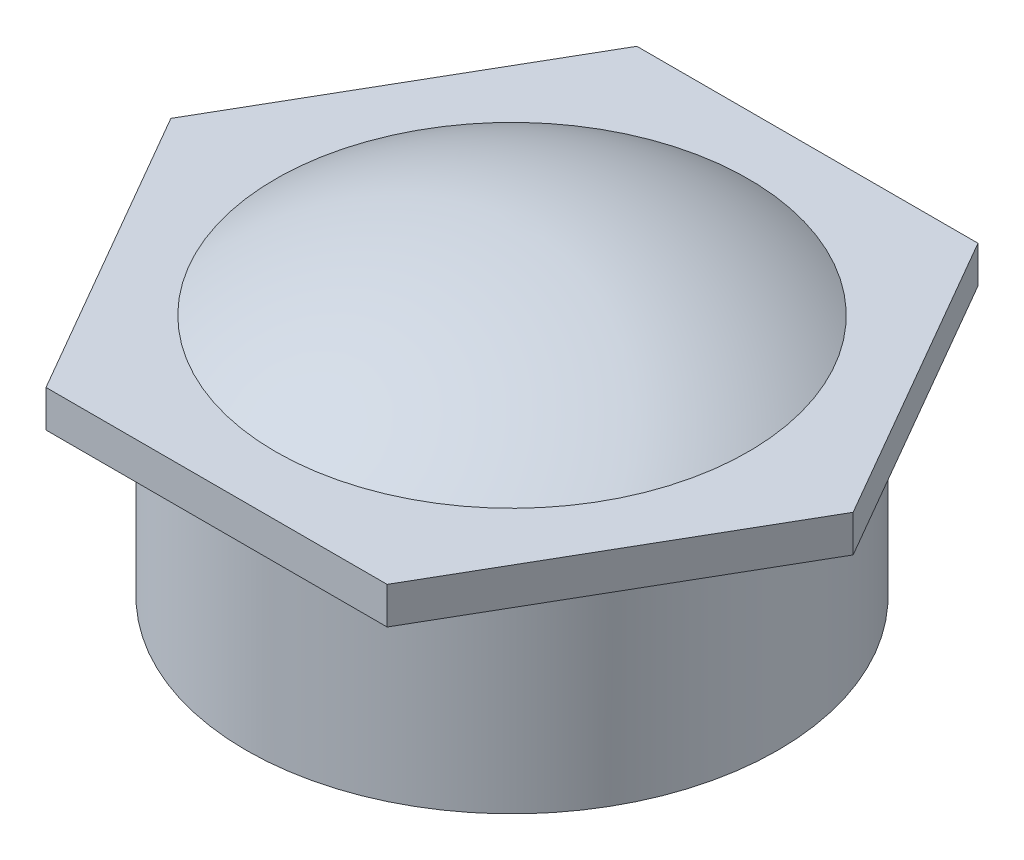
ISO-10303-21;
HEADER;
FILE_DESCRIPTION(('STEP AP214'),'2;1');
FILE_NAME('part.step','',(''),(''),'','','');
FILE_SCHEMA(('AUTOMOTIVE_DESIGN { 1 0 10303 214 1 1 1 1 }'));
ENDSEC;
DATA;
#1=APPLICATION_CONTEXT('core data for automotive mechanical design processes');
#2=APPLICATION_PROTOCOL_DEFINITION('international standard','automotive_design',2000,#1);
#3=PRODUCT_CONTEXT('',#1,'mechanical');
#4=PRODUCT('Part','Part','',(#3));
#5=PRODUCT_RELATED_PRODUCT_CATEGORY('part','',(#4));
#6=PRODUCT_DEFINITION_FORMATION('','',#4);
#7=PRODUCT_DEFINITION_CONTEXT('part definition',#1,'design');
#8=PRODUCT_DEFINITION('design','',#6,#7);
#9=PRODUCT_DEFINITION_SHAPE('','',#8);
#10=(LENGTH_UNIT() NAMED_UNIT(*) SI_UNIT(.MILLI.,.METRE.));
#11=(NAMED_UNIT(*) PLANE_ANGLE_UNIT() SI_UNIT($,.RADIAN.));
#12=(NAMED_UNIT(*) SI_UNIT($,.STERADIAN.) SOLID_ANGLE_UNIT());
#13=UNCERTAINTY_MEASURE_WITH_UNIT(LENGTH_MEASURE(1.E-05),#10,'distance_accuracy_value','');
#14=(GEOMETRIC_REPRESENTATION_CONTEXT(3) GLOBAL_UNCERTAINTY_ASSIGNED_CONTEXT((#13)) GLOBAL_UNIT_ASSIGNED_CONTEXT((#10,
#11,#12)) REPRESENTATION_CONTEXT('',''));
#15=CARTESIAN_POINT('',(0.,0.,0.));
#16=DIRECTION('',(0.,0.,1.));
#17=DIRECTION('',(1.,0.,0.));
#18=AXIS2_PLACEMENT_3D('',#15,#16,#17);
#19=CARTESIAN_POINT('',(0.,2.5,0.));
#20=DIRECTION('',(0.,1.,0.));
#21=DIRECTION('',(0.,0.,1.));
#22=AXIS2_PLACEMENT_3D('',#19,#20,#21);
#23=PLANE('',#22);
#24=DIRECTION('',(0.499999999999995,0.,-0.866025403784441));
#25=VECTOR('',#24,1.);
#26=CARTESIAN_POINT('',(11.5470053837928,2.5,19.9999999999999));
#27=LINE('',#26,#25);
#28=CARTESIAN_POINT('',(11.5470053837928,2.5,19.9999999999999));
#29=VERTEX_POINT('',#28);
#30=CARTESIAN_POINT('',(23.0940107675851,2.5,0.));
#31=VERTEX_POINT('',#30);
#32=EDGE_CURVE('E147',#29,#31,#27,.T.);
#33=ORIENTED_EDGE('',*,*,#32,.T.);
#34=DIRECTION('',(-0.500000000000001,0.,-0.866025403784438));
#35=VECTOR('',#34,1.);
#36=CARTESIAN_POINT('',(23.0940107675851,2.5,0.));
#37=LINE('',#36,#35);
#38=CARTESIAN_POINT('',(11.5470053837925,2.5,-20.));
#39=VERTEX_POINT('',#38);
#40=EDGE_CURVE('E105',#31,#39,#37,.T.);
#41=ORIENTED_EDGE('',*,*,#40,.T.);
#42=DIRECTION('',(-1.,0.,0.));
#43=VECTOR('',#42,1.);
#44=CARTESIAN_POINT('',(11.5470053837925,2.5,-20.));
#45=LINE('',#44,#43);
#46=CARTESIAN_POINT('',(-11.5470053837926,2.5,-20.));
#47=VERTEX_POINT('',#46);
#48=EDGE_CURVE('E118',#39,#47,#45,.T.);
#49=ORIENTED_EDGE('',*,*,#48,.T.);
#50=DIRECTION('',(-0.499999999999995,0.,0.866025403784442));
#51=VECTOR('',#50,1.);
#52=CARTESIAN_POINT('',(-11.5470053837926,2.5,-20.));
#53=LINE('',#52,#51);
#54=CARTESIAN_POINT('',(-23.0940107675851,2.5,1.61264615268131E-13));
#55=VERTEX_POINT('',#54);
#56=EDGE_CURVE('E112',#47,#55,#53,.T.);
#57=ORIENTED_EDGE('',*,*,#56,.T.);
#58=DIRECTION('',(0.500000000000007,0.,0.866025403784434));
#59=VECTOR('',#58,1.);
#60=CARTESIAN_POINT('',(-23.0940107675851,2.5,1.61264615268131E-13));
#61=LINE('',#60,#59);
#62=CARTESIAN_POINT('',(-11.5470053837923,2.5,20.0000000000001));
#63=VERTEX_POINT('',#62);
#64=EDGE_CURVE('E116',#55,#63,#61,.T.);
#65=ORIENTED_EDGE('',*,*,#64,.T.);
#66=DIRECTION('',(1.,0.,0.));
#67=VECTOR('',#66,1.);
#68=CARTESIAN_POINT('',(-11.5470053837923,2.5,20.0000000000001));
#69=LINE('',#68,#67);
#70=EDGE_CURVE('E67',#63,#29,#69,.T.);
#71=ORIENTED_EDGE('',*,*,#70,.T.);
#72=EDGE_LOOP('',(#33,#41,#49,#57,#65,#71));
#73=FACE_BOUND('',#72,.T.);
#74=CARTESIAN_POINT('',(0.,2.5,0.));
#75=DIRECTION('',(0.,1.,0.));
#76=DIRECTION('',(0.,0.,1.));
#77=AXIS2_PLACEMENT_3D('',#74,#75,#76);
#78=CIRCLE('',#77,16.);
#79=CARTESIAN_POINT('',(0.,2.5,16.));
#80=VERTEX_POINT('',#79);
#81=EDGE_CURVE('E11',#80,#80,#78,.F.);
#82=ORIENTED_EDGE('',*,*,#81,.T.);
#83=EDGE_LOOP('',(#82));
#84=FACE_BOUND('',#83,.T.);
#85=ADVANCED_FACE('F49',(#73,#84),#23,.T.);
#86=CARTESIAN_POINT('',(11.5470053837928,2.5,19.9999999999999));
#87=DIRECTION('',(-0.866025403784441,0.,-0.499999999999995));
#88=DIRECTION('',(-0.499999999999995,0.,0.866025403784441));
#89=AXIS2_PLACEMENT_3D('',#86,#87,#88);
#90=PLANE('',#89);
#91=DIRECTION('',(0.499999999999995,0.,-0.866025403784441));
#92=VECTOR('',#91,1.);
#93=CARTESIAN_POINT('',(11.5470053837928,0.,19.9999999999999));
#94=LINE('',#93,#92);
#95=CARTESIAN_POINT('',(11.5470053837928,0.,19.9999999999999));
#96=VERTEX_POINT('',#95);
#97=CARTESIAN_POINT('',(23.0940107675851,0.,0.));
#98=VERTEX_POINT('',#97);
#99=EDGE_CURVE('E136',#96,#98,#94,.T.);
#100=ORIENTED_EDGE('',*,*,#99,.T.);
#101=DIRECTION('',(0.,-1.,0.));
#102=VECTOR('',#101,1.);
#103=CARTESIAN_POINT('',(23.0940107675851,2.5,0.));
#104=LINE('',#103,#102);
#105=EDGE_CURVE('E154',#31,#98,#104,.T.);
#106=ORIENTED_EDGE('',*,*,#105,.F.);
#107=ORIENTED_EDGE('',*,*,#32,.F.);
#108=DIRECTION('',(0.,-1.,0.));
#109=VECTOR('',#108,1.);
#110=CARTESIAN_POINT('',(11.5470053837928,2.5,19.9999999999999));
#111=LINE('',#110,#109);
#112=EDGE_CURVE('E132',#29,#96,#111,.T.);
#113=ORIENTED_EDGE('',*,*,#112,.T.);
#114=EDGE_LOOP('',(#100,#106,#107,#113));
#115=FACE_BOUND('',#114,.T.);
#116=ADVANCED_FACE('F170',(#115),#90,.F.);
#117=CARTESIAN_POINT('',(23.0940107675851,2.5,0.));
#118=DIRECTION('',(-0.866025403784438,0.,0.500000000000001));
#119=DIRECTION('',(0.500000000000001,0.,0.866025403784438));
#120=AXIS2_PLACEMENT_3D('',#117,#118,#119);
#121=PLANE('',#120);
#122=DIRECTION('',(-0.500000000000001,0.,-0.866025403784438));
#123=VECTOR('',#122,1.);
#124=CARTESIAN_POINT('',(23.0940107675851,0.,0.));
#125=LINE('',#124,#123);
#126=CARTESIAN_POINT('',(11.5470053837925,0.,-20.));
#127=VERTEX_POINT('',#126);
#128=EDGE_CURVE('E139',#98,#127,#125,.T.);
#129=ORIENTED_EDGE('',*,*,#128,.T.);
#130=DIRECTION('',(0.,-1.,0.));
#131=VECTOR('',#130,1.);
#132=CARTESIAN_POINT('',(11.5470053837925,2.5,-20.));
#133=LINE('',#132,#131);
#134=EDGE_CURVE('E151',#39,#127,#133,.T.);
#135=ORIENTED_EDGE('',*,*,#134,.F.);
#136=ORIENTED_EDGE('',*,*,#40,.F.);
#137=ORIENTED_EDGE('',*,*,#105,.T.);
#138=EDGE_LOOP('',(#129,#135,#136,#137));
#139=FACE_BOUND('',#138,.T.);
#140=ADVANCED_FACE('F187',(#139),#121,.F.);
#141=CARTESIAN_POINT('',(11.5470053837925,2.5,-20.));
#142=DIRECTION('',(0.,0.,1.));
#143=DIRECTION('',(1.,0.,0.));
#144=AXIS2_PLACEMENT_3D('',#141,#142,#143);
#145=PLANE('',#144);
#146=DIRECTION('',(-1.,0.,0.));
#147=VECTOR('',#146,1.);
#148=CARTESIAN_POINT('',(11.5470053837925,0.,-20.));
#149=LINE('',#148,#147);
#150=CARTESIAN_POINT('',(-11.5470053837926,0.,-20.));
#151=VERTEX_POINT('',#150);
#152=EDGE_CURVE('E142',#127,#151,#149,.T.);
#153=ORIENTED_EDGE('',*,*,#152,.T.);
#154=DIRECTION('',(0.,-1.,0.));
#155=VECTOR('',#154,1.);
#156=CARTESIAN_POINT('',(-11.5470053837926,2.5,-20.));
#157=LINE('',#156,#155);
#158=EDGE_CURVE('E127',#47,#151,#157,.T.);
#159=ORIENTED_EDGE('',*,*,#158,.F.);
#160=ORIENTED_EDGE('',*,*,#48,.F.);
#161=ORIENTED_EDGE('',*,*,#134,.T.);
#162=EDGE_LOOP('',(#153,#159,#160,#161));
#163=FACE_BOUND('',#162,.T.);
#164=ADVANCED_FACE('F216',(#163),#145,.F.);
#165=CARTESIAN_POINT('',(-11.5470053837926,2.5,-20.));
#166=DIRECTION('',(0.866025403784442,0.,0.499999999999995));
#167=DIRECTION('',(0.499999999999995,0.,-0.866025403784442));
#168=AXIS2_PLACEMENT_3D('',#165,#166,#167);
#169=PLANE('',#168);
#170=DIRECTION('',(-0.499999999999995,0.,0.866025403784442));
#171=VECTOR('',#170,1.);
#172=CARTESIAN_POINT('',(-11.5470053837926,0.,-20.));
#173=LINE('',#172,#171);
#174=CARTESIAN_POINT('',(-23.0940107675851,0.,1.61264615268131E-13));
#175=VERTEX_POINT('',#174);
#176=EDGE_CURVE('E126',#151,#175,#173,.T.);
#177=ORIENTED_EDGE('',*,*,#176,.T.);
#178=DIRECTION('',(0.,-1.,0.));
#179=VECTOR('',#178,1.);
#180=CARTESIAN_POINT('',(-23.0940107675851,2.5,1.61264615268131E-13));
#181=LINE('',#180,#179);
#182=EDGE_CURVE('E123',#55,#175,#181,.T.);
#183=ORIENTED_EDGE('',*,*,#182,.F.);
#184=ORIENTED_EDGE('',*,*,#56,.F.);
#185=ORIENTED_EDGE('',*,*,#158,.T.);
#186=EDGE_LOOP('',(#177,#183,#184,#185));
#187=FACE_BOUND('',#186,.T.);
#188=ADVANCED_FACE('F124',(#187),#169,.F.);
#189=CARTESIAN_POINT('',(-23.0940107675851,2.5,1.61264615268131E-13));
#190=DIRECTION('',(0.866025403784435,0.,-0.500000000000007));
#191=DIRECTION('',(-0.500000000000007,0.,-0.866025403784435));
#192=AXIS2_PLACEMENT_3D('',#189,#190,#191);
#193=PLANE('',#192);
#194=DIRECTION('',(0.500000000000007,0.,0.866025403784434));
#195=VECTOR('',#194,1.);
#196=CARTESIAN_POINT('',(-23.0940107675851,0.,1.61264615268131E-13));
#197=LINE('',#196,#195);
#198=CARTESIAN_POINT('',(-11.5470053837923,0.,20.0000000000001));
#199=VERTEX_POINT('',#198);
#200=EDGE_CURVE('E90',#175,#199,#197,.T.);
#201=ORIENTED_EDGE('',*,*,#200,.T.);
#202=DIRECTION('',(0.,-1.,0.));
#203=VECTOR('',#202,1.);
#204=CARTESIAN_POINT('',(-11.5470053837923,2.5,20.0000000000001));
#205=LINE('',#204,#203);
#206=EDGE_CURVE('E128',#63,#199,#205,.T.);
#207=ORIENTED_EDGE('',*,*,#206,.F.);
#208=ORIENTED_EDGE('',*,*,#64,.F.);
#209=ORIENTED_EDGE('',*,*,#182,.T.);
#210=EDGE_LOOP('',(#201,#207,#208,#209));
#211=FACE_BOUND('',#210,.T.);
#212=ADVANCED_FACE('F130',(#211),#193,.F.);
#213=CARTESIAN_POINT('',(-11.5470053837923,2.5,20.0000000000001));
#214=DIRECTION('',(0.,0.,-1.));
#215=DIRECTION('',(-1.,0.,0.));
#216=AXIS2_PLACEMENT_3D('',#213,#214,#215);
#217=PLANE('',#216);
#218=DIRECTION('',(1.,0.,0.));
#219=VECTOR('',#218,1.);
#220=CARTESIAN_POINT('',(-11.5470053837923,0.,20.0000000000001));
#221=LINE('',#220,#219);
#222=EDGE_CURVE('E96',#199,#96,#221,.T.);
#223=ORIENTED_EDGE('',*,*,#222,.T.);
#224=ORIENTED_EDGE('',*,*,#112,.F.);
#225=ORIENTED_EDGE('',*,*,#70,.F.);
#226=ORIENTED_EDGE('',*,*,#206,.T.);
#227=EDGE_LOOP('',(#223,#224,#225,#226));
#228=FACE_BOUND('',#227,.T.);
#229=ADVANCED_FACE('F172',(#228),#217,.F.);
#230=CARTESIAN_POINT('',(0.,-20.6,0.));
#231=DIRECTION('',(0.,0.,1.));
#232=DIRECTION('',(1.,0.,0.));
#233=AXIS2_PLACEMENT_3D('',#230,#231,#232);
#234=SPHERICAL_SURFACE('',#233,28.1);
#235=CARTESIAN_POINT('',(0.,-20.6,0.));
#236=DIRECTION('',(0.,1.,0.));
#237=DIRECTION('',(0.,0.,1.));
#238=AXIS2_PLACEMENT_3D('',#235,#236,#237);
#239=SPHERICAL_SURFACE('',#238,28.1);
#240=ORIENTED_EDGE('',*,*,#81,.F.);
#241=EDGE_LOOP('',(#240));
#242=FACE_BOUND('',#241,.T.);
#243=ADVANCED_FACE('F51',(#242),#239,.T.);
#244=CARTESIAN_POINT('',(0.,0.,0.));
#245=DIRECTION('',(0.,1.,0.));
#246=DIRECTION('',(0.,0.,1.));
#247=AXIS2_PLACEMENT_3D('',#244,#245,#246);
#248=PLANE('',#247);
#249=CARTESIAN_POINT('',(0.,0.,0.));
#250=DIRECTION('',(0.,1.,0.));
#251=DIRECTION('',(0.,0.,1.));
#252=AXIS2_PLACEMENT_3D('',#249,#250,#251);
#253=CIRCLE('',#252,18.);
#254=CARTESIAN_POINT('',(0.,0.,18.));
#255=VERTEX_POINT('',#254);
#256=EDGE_CURVE('E59',#255,#255,#253,.F.);
#257=ORIENTED_EDGE('',*,*,#256,.F.);
#258=EDGE_LOOP('',(#257));
#259=FACE_BOUND('',#258,.T.);
#260=ORIENTED_EDGE('',*,*,#99,.F.);
#261=ORIENTED_EDGE('',*,*,#222,.F.);
#262=ORIENTED_EDGE('',*,*,#200,.F.);
#263=ORIENTED_EDGE('',*,*,#176,.F.);
#264=ORIENTED_EDGE('',*,*,#152,.F.);
#265=ORIENTED_EDGE('',*,*,#128,.F.);
#266=EDGE_LOOP('',(#260,#261,#262,#263,#264,#265));
#267=FACE_BOUND('',#266,.T.);
#268=ADVANCED_FACE('F160',(#259,#267),#248,.F.);
#269=CARTESIAN_POINT('',(0.,-14.,0.));
#270=DIRECTION('',(0.,-1.,0.));
#271=DIRECTION('',(0.,0.,-1.));
#272=AXIS2_PLACEMENT_3D('',#269,#270,#271);
#273=PLANE('',#272);
#274=CARTESIAN_POINT('',(0.,-14.,0.));
#275=DIRECTION('',(0.,-1.,0.));
#276=DIRECTION('',(0.,0.,-1.));
#277=AXIS2_PLACEMENT_3D('',#274,#275,#276);
#278=CIRCLE('',#277,18.);
#279=CARTESIAN_POINT('',(0.,-14.,-18.));
#280=VERTEX_POINT('',#279);
#281=EDGE_CURVE('E140',#280,#280,#278,.T.);
#282=ORIENTED_EDGE('',*,*,#281,.T.);
#283=EDGE_LOOP('',(#282));
#284=FACE_BOUND('',#283,.T.);
#285=CARTESIAN_POINT('',(0.,-14.,0.));
#286=DIRECTION('',(0.,-1.,0.));
#287=DIRECTION('',(0.,0.,-1.));
#288=AXIS2_PLACEMENT_3D('',#285,#286,#287);
#289=CIRCLE('',#288,10.);
#290=CARTESIAN_POINT('',(0.,-14.,-10.));
#291=VERTEX_POINT('',#290);
#292=EDGE_CURVE('E205',#291,#291,#289,.T.);
#293=ORIENTED_EDGE('',*,*,#292,.F.);
#294=EDGE_LOOP('',(#293));
#295=FACE_BOUND('',#294,.T.);
#296=ADVANCED_FACE('F163',(#284,#295),#273,.T.);
#297=CARTESIAN_POINT('',(0.,-14.,0.));
#298=DIRECTION('',(0.,1.,0.));
#299=DIRECTION('',(0.,0.,1.));
#300=AXIS2_PLACEMENT_3D('',#297,#298,#299);
#301=CYLINDRICAL_SURFACE('',#300,18.);
#302=ORIENTED_EDGE('',*,*,#281,.F.);
#303=EDGE_LOOP('',(#302));
#304=FACE_BOUND('',#303,.T.);
#305=ORIENTED_EDGE('',*,*,#256,.T.);
#306=EDGE_LOOP('',(#305));
#307=FACE_BOUND('',#306,.T.);
#308=ADVANCED_FACE('F158',(#304,#307),#301,.T.);
#309=CARTESIAN_POINT('',(0.,-14.,0.));
#310=DIRECTION('',(0.,1.,0.));
#311=DIRECTION('',(0.,0.,1.));
#312=AXIS2_PLACEMENT_3D('',#309,#310,#311);
#313=CYLINDRICAL_SURFACE('',#312,10.);
#314=ORIENTED_EDGE('',*,*,#292,.T.);
#315=EDGE_LOOP('',(#314));
#316=FACE_BOUND('',#315,.T.);
#317=CARTESIAN_POINT('',(0.,0.,0.));
#318=DIRECTION('',(0.,-1.,0.));
#319=DIRECTION('',(0.,0.,-1.));
#320=AXIS2_PLACEMENT_3D('',#317,#318,#319);
#321=CIRCLE('',#320,10.);
#322=CARTESIAN_POINT('',(0.,0.,-10.));
#323=VERTEX_POINT('',#322);
#324=EDGE_CURVE('E208',#323,#323,#321,.T.);
#325=ORIENTED_EDGE('',*,*,#324,.F.);
#326=EDGE_LOOP('',(#325));
#327=FACE_BOUND('',#326,.T.);
#328=ADVANCED_FACE('F191',(#316,#327),#313,.F.);
#329=ORIENTED_EDGE('',*,*,#324,.T.);
#330=EDGE_LOOP('',(#329));
#331=FACE_BOUND('',#330,.T.);
#332=ADVANCED_FACE('F165',(#331),#248,.F.);
#333=CLOSED_SHELL('',(#85,#116,#140,#164,#188,#212,#229,#243,#268,#296,#308,#328,#332));
#334=MANIFOLD_SOLID_BREP('B2',#333);
#335=ADVANCED_BREP_SHAPE_REPRESENTATION('',(#18,#334),#14);
#336=SHAPE_DEFINITION_REPRESENTATION(#9,#335);
ENDSEC;
END-ISO-10303-21;
